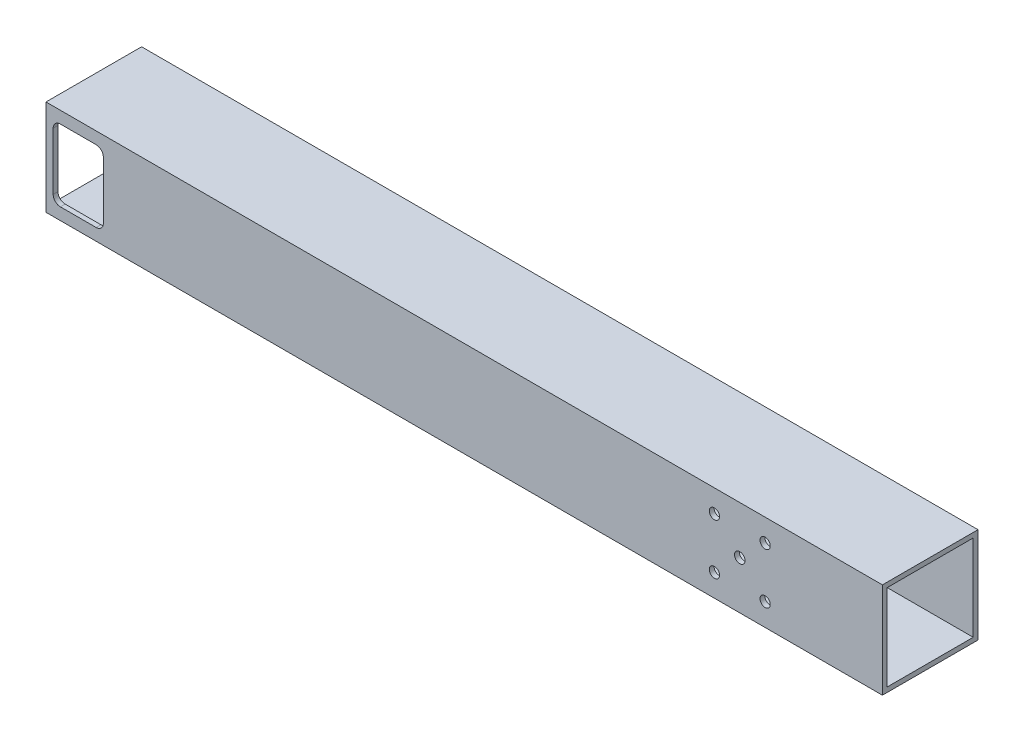
ISO-10303-21;
HEADER;
FILE_DESCRIPTION(('STEP AP214'),'2;1');
FILE_NAME('part.step','',(''),(''),'','','');
FILE_SCHEMA(('AUTOMOTIVE_DESIGN { 1 0 10303 214 1 1 1 1 }'));
ENDSEC;
DATA;
#1=APPLICATION_CONTEXT('core data for automotive mechanical design processes');
#2=APPLICATION_PROTOCOL_DEFINITION('international standard','automotive_design',2000,#1);
#3=PRODUCT_CONTEXT('',#1,'mechanical');
#4=PRODUCT('Part','Part','',(#3));
#5=PRODUCT_RELATED_PRODUCT_CATEGORY('part','',(#4));
#6=PRODUCT_DEFINITION_FORMATION('','',#4);
#7=PRODUCT_DEFINITION_CONTEXT('part definition',#1,'design');
#8=PRODUCT_DEFINITION('design','',#6,#7);
#9=PRODUCT_DEFINITION_SHAPE('','',#8);
#10=(LENGTH_UNIT() NAMED_UNIT(*) SI_UNIT(.MILLI.,.METRE.));
#11=(NAMED_UNIT(*) PLANE_ANGLE_UNIT() SI_UNIT($,.RADIAN.));
#12=(NAMED_UNIT(*) SI_UNIT($,.STERADIAN.) SOLID_ANGLE_UNIT());
#13=UNCERTAINTY_MEASURE_WITH_UNIT(LENGTH_MEASURE(1.E-05),#10,'distance_accuracy_value','');
#14=(GEOMETRIC_REPRESENTATION_CONTEXT(3) GLOBAL_UNCERTAINTY_ASSIGNED_CONTEXT((#13)) GLOBAL_UNIT_ASSIGNED_CONTEXT((#10,
#11,#12)) REPRESENTATION_CONTEXT('',''));
#15=CARTESIAN_POINT('',(0.,0.,0.));
#16=DIRECTION('',(0.,0.,1.));
#17=DIRECTION('',(1.,0.,0.));
#18=AXIS2_PLACEMENT_3D('',#15,#16,#17);
#19=CARTESIAN_POINT('',(350.,2.,-2.));
#20=DIRECTION('',(0.,0.,-1.));
#21=DIRECTION('',(-1.,0.,0.));
#22=AXIS2_PLACEMENT_3D('',#19,#20,#21);
#23=PLANE('',#22);
#24=CARTESIAN_POINT('',(21.,32.,-2.));
#25=DIRECTION('',(0.,0.,-1.));
#26=DIRECTION('',(-1.,0.,0.));
#27=AXIS2_PLACEMENT_3D('',#24,#25,#26);
#28=CIRCLE('',#27,3.);
#29=CARTESIAN_POINT('',(24.,32.,-2.));
#30=VERTEX_POINT('',#29);
#31=CARTESIAN_POINT('',(21.,35.,-2.));
#32=VERTEX_POINT('',#31);
#33=EDGE_CURVE('E377',#30,#32,#28,.F.);
#34=ORIENTED_EDGE('',*,*,#33,.T.);
#35=DIRECTION('',(-1.,0.,0.));
#36=VECTOR('',#35,1.);
#37=CARTESIAN_POINT('',(6.,35.,-2.));
#38=LINE('',#37,#36);
#39=CARTESIAN_POINT('',(5.99999999999995,35.,-2.));
#40=VERTEX_POINT('',#39);
#41=EDGE_CURVE('E507',#32,#40,#38,.T.);
#42=ORIENTED_EDGE('',*,*,#41,.T.);
#43=CARTESIAN_POINT('',(6.,32.,-2.));
#44=DIRECTION('',(0.,0.,-1.));
#45=DIRECTION('',(-1.,0.,0.));
#46=AXIS2_PLACEMENT_3D('',#43,#44,#45);
#47=CIRCLE('',#46,3.);
#48=CARTESIAN_POINT('',(3.,32.,-2.));
#49=VERTEX_POINT('',#48);
#50=EDGE_CURVE('E398',#40,#49,#47,.F.);
#51=ORIENTED_EDGE('',*,*,#50,.T.);
#52=DIRECTION('',(0.,-1.,0.));
#53=VECTOR('',#52,1.);
#54=CARTESIAN_POINT('',(3.,32.,-2.));
#55=LINE('',#54,#53);
#56=CARTESIAN_POINT('',(3.,8.,-2.));
#57=VERTEX_POINT('',#56);
#58=EDGE_CURVE('E399',#49,#57,#55,.T.);
#59=ORIENTED_EDGE('',*,*,#58,.T.);
#60=CARTESIAN_POINT('',(6.,8.,-2.));
#61=DIRECTION('',(0.,0.,-1.));
#62=DIRECTION('',(-1.,0.,0.));
#63=AXIS2_PLACEMENT_3D('',#60,#61,#62);
#64=CIRCLE('',#63,3.);
#65=CARTESIAN_POINT('',(6.,5.,-2.));
#66=VERTEX_POINT('',#65);
#67=EDGE_CURVE('E404',#57,#66,#64,.F.);
#68=ORIENTED_EDGE('',*,*,#67,.T.);
#69=DIRECTION('',(1.,0.,0.));
#70=VECTOR('',#69,1.);
#71=CARTESIAN_POINT('',(6.,5.,-2.));
#72=LINE('',#71,#70);
#73=CARTESIAN_POINT('',(21.,5.,-2.));
#74=VERTEX_POINT('',#73);
#75=EDGE_CURVE('E408',#66,#74,#72,.T.);
#76=ORIENTED_EDGE('',*,*,#75,.T.);
#77=CARTESIAN_POINT('',(21.,8.,-2.));
#78=DIRECTION('',(0.,0.,-1.));
#79=DIRECTION('',(-1.,0.,0.));
#80=AXIS2_PLACEMENT_3D('',#77,#78,#79);
#81=CIRCLE('',#80,3.);
#82=CARTESIAN_POINT('',(24.,8.,-2.));
#83=VERTEX_POINT('',#82);
#84=EDGE_CURVE('E381',#74,#83,#81,.F.);
#85=ORIENTED_EDGE('',*,*,#84,.T.);
#86=DIRECTION('',(0.,1.,0.));
#87=VECTOR('',#86,1.);
#88=CARTESIAN_POINT('',(24.,32.,-2.));
#89=LINE('',#88,#87);
#90=EDGE_CURVE('E382',#83,#30,#89,.T.);
#91=ORIENTED_EDGE('',*,*,#90,.T.);
#92=EDGE_LOOP('',(#34,#42,#51,#59,#68,#76,#85,#91));
#93=FACE_BOUND('',#92,.T.);
#94=CARTESIAN_POINT('',(290.312997683596,19.9999999999998,-2.));
#95=DIRECTION('',(0.,0.,-1.));
#96=DIRECTION('',(-1.,0.,0.));
#97=AXIS2_PLACEMENT_3D('',#94,#95,#96);
#98=CIRCLE('',#97,2.19999999999998);
#99=CARTESIAN_POINT('',(288.112997683597,19.9999999999998,-2.));
#100=VERTEX_POINT('',#99);
#101=EDGE_CURVE('E204',#100,#100,#98,.T.);
#102=ORIENTED_EDGE('',*,*,#101,.F.);
#103=EDGE_LOOP('',(#102));
#104=FACE_BOUND('',#103,.T.);
#105=CARTESIAN_POINT('',(300.919599401395,30.6066017177983,-2.));
#106=DIRECTION('',(0.,0.,-1.));
#107=DIRECTION('',(-1.,0.,0.));
#108=AXIS2_PLACEMENT_3D('',#105,#106,#107);
#109=CIRCLE('',#108,2.14999999999999);
#110=CARTESIAN_POINT('',(298.769599401395,30.6066017177983,-2.));
#111=VERTEX_POINT('',#110);
#112=EDGE_CURVE('E231',#111,#111,#109,.F.);
#113=ORIENTED_EDGE('',*,*,#112,.T.);
#114=EDGE_LOOP('',(#113));
#115=FACE_BOUND('',#114,.T.);
#116=CARTESIAN_POINT('',(300.919599401395,9.39339828220176,-2.));
#117=DIRECTION('',(0.,0.,-1.));
#118=DIRECTION('',(-1.,0.,0.));
#119=AXIS2_PLACEMENT_3D('',#116,#117,#118);
#120=CIRCLE('',#119,2.14999999999999);
#121=CARTESIAN_POINT('',(298.769599401395,9.39339828220176,-2.));
#122=VERTEX_POINT('',#121);
#123=EDGE_CURVE('E239',#122,#122,#120,.F.);
#124=ORIENTED_EDGE('',*,*,#123,.T.);
#125=EDGE_LOOP('',(#124));
#126=FACE_BOUND('',#125,.T.);
#127=CARTESIAN_POINT('',(279.706395965798,9.39339828220152,-2.));
#128=DIRECTION('',(0.,0.,-1.));
#129=DIRECTION('',(-1.,0.,0.));
#130=AXIS2_PLACEMENT_3D('',#127,#128,#129);
#131=CIRCLE('',#130,2.14999999999999);
#132=CARTESIAN_POINT('',(277.556395965798,9.39339828220152,-2.));
#133=VERTEX_POINT('',#132);
#134=EDGE_CURVE('E247',#133,#133,#131,.F.);
#135=ORIENTED_EDGE('',*,*,#134,.T.);
#136=EDGE_LOOP('',(#135));
#137=FACE_BOUND('',#136,.T.);
#138=DIRECTION('',(0.,-1.,0.));
#139=VECTOR('',#138,1.);
#140=CARTESIAN_POINT('',(0.,2.,-2.));
#141=LINE('',#140,#139);
#142=CARTESIAN_POINT('',(0.,38.,-2.));
#143=VERTEX_POINT('',#142);
#144=CARTESIAN_POINT('',(0.,2.,-2.));
#145=VERTEX_POINT('',#144);
#146=EDGE_CURVE('E264',#143,#145,#141,.T.);
#147=ORIENTED_EDGE('',*,*,#146,.F.);
#148=DIRECTION('',(-1.,0.,0.));
#149=VECTOR('',#148,1.);
#150=CARTESIAN_POINT('',(350.,38.,-2.));
#151=LINE('',#150,#149);
#152=CARTESIAN_POINT('',(350.,38.,-2.));
#153=VERTEX_POINT('',#152);
#154=EDGE_CURVE('E292',#153,#143,#151,.T.);
#155=ORIENTED_EDGE('',*,*,#154,.F.);
#156=DIRECTION('',(0.,-1.,0.));
#157=VECTOR('',#156,1.);
#158=CARTESIAN_POINT('',(350.,2.,-2.));
#159=LINE('',#158,#157);
#160=CARTESIAN_POINT('',(350.,2.,-2.));
#161=VERTEX_POINT('',#160);
#162=EDGE_CURVE('E271',#153,#161,#159,.T.);
#163=ORIENTED_EDGE('',*,*,#162,.T.);
#164=DIRECTION('',(-1.,0.,0.));
#165=VECTOR('',#164,1.);
#166=CARTESIAN_POINT('',(350.,2.,-2.));
#167=LINE('',#166,#165);
#168=EDGE_CURVE('E274',#161,#145,#167,.T.);
#169=ORIENTED_EDGE('',*,*,#168,.T.);
#170=EDGE_LOOP('',(#147,#155,#163,#169));
#171=FACE_BOUND('',#170,.T.);
#172=CARTESIAN_POINT('',(279.706395965798,30.606601717798,-2.));
#173=DIRECTION('',(0.,0.,-1.));
#174=DIRECTION('',(-1.,0.,0.));
#175=AXIS2_PLACEMENT_3D('',#172,#173,#174);
#176=CIRCLE('',#175,2.14999999999999);
#177=CARTESIAN_POINT('',(277.556395965798,30.606601717798,-2.));
#178=VERTEX_POINT('',#177);
#179=EDGE_CURVE('E255',#178,#178,#176,.F.);
#180=ORIENTED_EDGE('',*,*,#179,.T.);
#181=EDGE_LOOP('',(#180));
#182=FACE_BOUND('',#181,.T.);
#183=ADVANCED_FACE('F46',(#93,#104,#115,#126,#137,#171,#182),#23,.T.);
#184=CARTESIAN_POINT('',(350.,0.,0.));
#185=DIRECTION('',(0.,0.,-1.));
#186=DIRECTION('',(-1.,0.,0.));
#187=AXIS2_PLACEMENT_3D('',#184,#185,#186);
#188=PLANE('',#187);
#189=DIRECTION('',(-1.,0.,0.));
#190=VECTOR('',#189,1.);
#191=CARTESIAN_POINT('',(350.,35.,0.));
#192=LINE('',#191,#190);
#193=CARTESIAN_POINT('',(6.,35.,0.));
#194=VERTEX_POINT('',#193);
#195=CARTESIAN_POINT('',(21.,35.,0.));
#196=VERTEX_POINT('',#195);
#197=EDGE_CURVE('E344',#194,#196,#192,.F.);
#198=ORIENTED_EDGE('',*,*,#197,.T.);
#199=CARTESIAN_POINT('',(21.,32.,0.));
#200=DIRECTION('',(0.,0.,1.));
#201=DIRECTION('',(1.,0.,0.));
#202=AXIS2_PLACEMENT_3D('',#199,#200,#201);
#203=CIRCLE('',#202,3.);
#204=CARTESIAN_POINT('',(24.,32.,0.));
#205=VERTEX_POINT('',#204);
#206=EDGE_CURVE('E11',#196,#205,#203,.F.);
#207=ORIENTED_EDGE('',*,*,#206,.T.);
#208=DIRECTION('',(0.,1.,0.));
#209=VECTOR('',#208,1.);
#210=CARTESIAN_POINT('',(24.,0.,0.));
#211=LINE('',#210,#209);
#212=CARTESIAN_POINT('',(24.,8.,0.));
#213=VERTEX_POINT('',#212);
#214=EDGE_CURVE('E56',#205,#213,#211,.F.);
#215=ORIENTED_EDGE('',*,*,#214,.T.);
#216=CARTESIAN_POINT('',(21.,8.,0.));
#217=DIRECTION('',(0.,0.,1.));
#218=DIRECTION('',(1.,0.,0.));
#219=AXIS2_PLACEMENT_3D('',#216,#217,#218);
#220=CIRCLE('',#219,3.);
#221=CARTESIAN_POINT('',(21.,5.,0.));
#222=VERTEX_POINT('',#221);
#223=EDGE_CURVE('E92',#213,#222,#220,.F.);
#224=ORIENTED_EDGE('',*,*,#223,.T.);
#225=DIRECTION('',(-1.,0.,0.));
#226=VECTOR('',#225,1.);
#227=CARTESIAN_POINT('',(350.,5.,0.));
#228=LINE('',#227,#226);
#229=CARTESIAN_POINT('',(6.,5.,0.));
#230=VERTEX_POINT('',#229);
#231=EDGE_CURVE('E360',#222,#230,#228,.T.);
#232=ORIENTED_EDGE('',*,*,#231,.T.);
#233=CARTESIAN_POINT('',(6.,8.,0.));
#234=DIRECTION('',(0.,0.,1.));
#235=DIRECTION('',(1.,0.,0.));
#236=AXIS2_PLACEMENT_3D('',#233,#234,#235);
#237=CIRCLE('',#236,3.);
#238=CARTESIAN_POINT('',(3.,8.,0.));
#239=VERTEX_POINT('',#238);
#240=EDGE_CURVE('E356',#230,#239,#237,.F.);
#241=ORIENTED_EDGE('',*,*,#240,.T.);
#242=DIRECTION('',(0.,1.,0.));
#243=VECTOR('',#242,1.);
#244=CARTESIAN_POINT('',(3.,0.,0.));
#245=LINE('',#244,#243);
#246=CARTESIAN_POINT('',(3.,32.,0.));
#247=VERTEX_POINT('',#246);
#248=EDGE_CURVE('E352',#239,#247,#245,.T.);
#249=ORIENTED_EDGE('',*,*,#248,.T.);
#250=CARTESIAN_POINT('',(6.,32.,0.));
#251=DIRECTION('',(0.,0.,1.));
#252=DIRECTION('',(1.,0.,0.));
#253=AXIS2_PLACEMENT_3D('',#250,#251,#252);
#254=CIRCLE('',#253,3.);
#255=EDGE_CURVE('E348',#247,#194,#254,.F.);
#256=ORIENTED_EDGE('',*,*,#255,.T.);
#257=EDGE_LOOP('',(#198,#207,#215,#224,#232,#241,#249,#256));
#258=FACE_BOUND('',#257,.T.);
#259=CARTESIAN_POINT('',(290.312997683596,19.9999999999998,0.));
#260=DIRECTION('',(0.,0.,-1.));
#261=DIRECTION('',(-1.,0.,0.));
#262=AXIS2_PLACEMENT_3D('',#259,#260,#261);
#263=CIRCLE('',#262,2.19999999999998);
#264=CARTESIAN_POINT('',(288.112997683597,19.9999999999998,0.));
#265=VERTEX_POINT('',#264);
#266=EDGE_CURVE('E198',#265,#265,#263,.T.);
#267=ORIENTED_EDGE('',*,*,#266,.T.);
#268=EDGE_LOOP('',(#267));
#269=FACE_BOUND('',#268,.T.);
#270=CARTESIAN_POINT('',(300.919599401395,30.6066017177983,0.));
#271=DIRECTION('',(0.,0.,1.));
#272=DIRECTION('',(1.,0.,0.));
#273=AXIS2_PLACEMENT_3D('',#270,#271,#272);
#274=CIRCLE('',#273,2.14999999999999);
#275=CARTESIAN_POINT('',(303.069599401394,30.6066017177983,0.));
#276=VERTEX_POINT('',#275);
#277=EDGE_CURVE('E227',#276,#276,#274,.T.);
#278=ORIENTED_EDGE('',*,*,#277,.F.);
#279=EDGE_LOOP('',(#278));
#280=FACE_BOUND('',#279,.T.);
#281=CARTESIAN_POINT('',(300.919599401395,9.39339828220176,0.));
#282=DIRECTION('',(0.,0.,1.));
#283=DIRECTION('',(1.,0.,0.));
#284=AXIS2_PLACEMENT_3D('',#281,#282,#283);
#285=CIRCLE('',#284,2.14999999999999);
#286=CARTESIAN_POINT('',(303.069599401395,9.39339828220176,0.));
#287=VERTEX_POINT('',#286);
#288=EDGE_CURVE('E235',#287,#287,#285,.T.);
#289=ORIENTED_EDGE('',*,*,#288,.F.);
#290=EDGE_LOOP('',(#289));
#291=FACE_BOUND('',#290,.T.);
#292=CARTESIAN_POINT('',(279.706395965798,9.39339828220152,0.));
#293=DIRECTION('',(0.,0.,1.));
#294=DIRECTION('',(1.,0.,0.));
#295=AXIS2_PLACEMENT_3D('',#292,#293,#294);
#296=CIRCLE('',#295,2.14999999999999);
#297=CARTESIAN_POINT('',(281.856395965798,9.39339828220152,0.));
#298=VERTEX_POINT('',#297);
#299=EDGE_CURVE('E243',#298,#298,#296,.T.);
#300=ORIENTED_EDGE('',*,*,#299,.F.);
#301=EDGE_LOOP('',(#300));
#302=FACE_BOUND('',#301,.T.);
#303=DIRECTION('',(0.,-1.,0.));
#304=VECTOR('',#303,1.);
#305=CARTESIAN_POINT('',(0.,0.,0.));
#306=LINE('',#305,#304);
#307=CARTESIAN_POINT('',(0.,40.,0.));
#308=VERTEX_POINT('',#307);
#309=CARTESIAN_POINT('',(0.,0.,0.));
#310=VERTEX_POINT('',#309);
#311=EDGE_CURVE('E302',#308,#310,#306,.T.);
#312=ORIENTED_EDGE('',*,*,#311,.T.);
#313=DIRECTION('',(-1.,0.,0.));
#314=VECTOR('',#313,1.);
#315=CARTESIAN_POINT('',(350.,0.,0.));
#316=LINE('',#315,#314);
#317=CARTESIAN_POINT('',(350.,0.,0.));
#318=VERTEX_POINT('',#317);
#319=EDGE_CURVE('E340',#318,#310,#316,.T.);
#320=ORIENTED_EDGE('',*,*,#319,.F.);
#321=DIRECTION('',(0.,-1.,0.));
#322=VECTOR('',#321,1.);
#323=CARTESIAN_POINT('',(350.,0.,0.));
#324=LINE('',#323,#322);
#325=CARTESIAN_POINT('',(350.,40.,0.));
#326=VERTEX_POINT('',#325);
#327=EDGE_CURVE('E303',#326,#318,#324,.T.);
#328=ORIENTED_EDGE('',*,*,#327,.F.);
#329=DIRECTION('',(-1.,0.,0.));
#330=VECTOR('',#329,1.);
#331=CARTESIAN_POINT('',(350.,40.,0.));
#332=LINE('',#331,#330);
#333=EDGE_CURVE('E317',#326,#308,#332,.T.);
#334=ORIENTED_EDGE('',*,*,#333,.T.);
#335=EDGE_LOOP('',(#312,#320,#328,#334));
#336=FACE_BOUND('',#335,.T.);
#337=CARTESIAN_POINT('',(279.706395965798,30.606601717798,0.));
#338=DIRECTION('',(0.,0.,1.));
#339=DIRECTION('',(1.,0.,0.));
#340=AXIS2_PLACEMENT_3D('',#337,#338,#339);
#341=CIRCLE('',#340,2.14999999999999);
#342=CARTESIAN_POINT('',(281.856395965798,30.606601717798,0.));
#343=VERTEX_POINT('',#342);
#344=EDGE_CURVE('E251',#343,#343,#341,.T.);
#345=ORIENTED_EDGE('',*,*,#344,.F.);
#346=EDGE_LOOP('',(#345));
#347=FACE_BOUND('',#346,.T.);
#348=ADVANCED_FACE('F48',(#258,#269,#280,#291,#302,#336,#347),#188,.F.);
#349=CARTESIAN_POINT('',(350.,0.,0.));
#350=DIRECTION('',(-1.,0.,0.));
#351=DIRECTION('',(0.,0.,1.));
#352=AXIS2_PLACEMENT_3D('',#349,#350,#351);
#353=PLANE('',#352);
#354=ORIENTED_EDGE('',*,*,#327,.T.);
#355=DIRECTION('',(0.,0.,-1.));
#356=VECTOR('',#355,1.);
#357=CARTESIAN_POINT('',(350.,0.,0.));
#358=LINE('',#357,#356);
#359=CARTESIAN_POINT('',(350.,0.,-40.));
#360=VERTEX_POINT('',#359);
#361=EDGE_CURVE('E307',#318,#360,#358,.T.);
#362=ORIENTED_EDGE('',*,*,#361,.T.);
#363=DIRECTION('',(0.,1.,0.));
#364=VECTOR('',#363,1.);
#365=CARTESIAN_POINT('',(350.,0.,-40.));
#366=LINE('',#365,#364);
#367=CARTESIAN_POINT('',(350.,40.,-40.));
#368=VERTEX_POINT('',#367);
#369=EDGE_CURVE('E311',#360,#368,#366,.T.);
#370=ORIENTED_EDGE('',*,*,#369,.T.);
#371=DIRECTION('',(0.,0.,1.));
#372=VECTOR('',#371,1.);
#373=CARTESIAN_POINT('',(350.,40.,0.));
#374=LINE('',#373,#372);
#375=EDGE_CURVE('E314',#368,#326,#374,.T.);
#376=ORIENTED_EDGE('',*,*,#375,.T.);
#377=EDGE_LOOP('',(#354,#362,#370,#376));
#378=FACE_BOUND('',#377,.T.);
#379=DIRECTION('',(0.,0.,-1.));
#380=VECTOR('',#379,1.);
#381=CARTESIAN_POINT('',(350.,2.,-2.));
#382=LINE('',#381,#380);
#383=CARTESIAN_POINT('',(350.,2.,-38.));
#384=VERTEX_POINT('',#383);
#385=EDGE_CURVE('E260',#161,#384,#382,.T.);
#386=ORIENTED_EDGE('',*,*,#385,.F.);
#387=ORIENTED_EDGE('',*,*,#162,.F.);
#388=DIRECTION('',(0.,0.,1.));
#389=VECTOR('',#388,1.);
#390=CARTESIAN_POINT('',(350.,38.,-2.));
#391=LINE('',#390,#389);
#392=CARTESIAN_POINT('',(350.,38.,-38.));
#393=VERTEX_POINT('',#392);
#394=EDGE_CURVE('E267',#393,#153,#391,.T.);
#395=ORIENTED_EDGE('',*,*,#394,.F.);
#396=DIRECTION('',(0.,1.,0.));
#397=VECTOR('',#396,1.);
#398=CARTESIAN_POINT('',(350.,2.,-38.));
#399=LINE('',#398,#397);
#400=EDGE_CURVE('E263',#384,#393,#399,.T.);
#401=ORIENTED_EDGE('',*,*,#400,.F.);
#402=EDGE_LOOP('',(#386,#387,#395,#401));
#403=FACE_BOUND('',#402,.T.);
#404=ADVANCED_FACE('F536',(#378,#403),#353,.F.);
#405=CARTESIAN_POINT('',(0.,0.,0.));
#406=DIRECTION('',(-1.,0.,0.));
#407=DIRECTION('',(0.,0.,1.));
#408=AXIS2_PLACEMENT_3D('',#405,#406,#407);
#409=PLANE('',#408);
#410=ORIENTED_EDGE('',*,*,#311,.F.);
#411=DIRECTION('',(0.,0.,1.));
#412=VECTOR('',#411,1.);
#413=CARTESIAN_POINT('',(0.,40.,0.));
#414=LINE('',#413,#412);
#415=CARTESIAN_POINT('',(0.,40.,-40.));
#416=VERTEX_POINT('',#415);
#417=EDGE_CURVE('E308',#416,#308,#414,.T.);
#418=ORIENTED_EDGE('',*,*,#417,.F.);
#419=DIRECTION('',(0.,1.,0.));
#420=VECTOR('',#419,1.);
#421=CARTESIAN_POINT('',(0.,0.,-40.));
#422=LINE('',#421,#420);
#423=CARTESIAN_POINT('',(0.,0.,-40.));
#424=VERTEX_POINT('',#423);
#425=EDGE_CURVE('E324',#424,#416,#422,.T.);
#426=ORIENTED_EDGE('',*,*,#425,.F.);
#427=DIRECTION('',(0.,0.,-1.));
#428=VECTOR('',#427,1.);
#429=CARTESIAN_POINT('',(0.,0.,0.));
#430=LINE('',#429,#428);
#431=EDGE_CURVE('E321',#310,#424,#430,.T.);
#432=ORIENTED_EDGE('',*,*,#431,.F.);
#433=EDGE_LOOP('',(#410,#418,#426,#432));
#434=FACE_BOUND('',#433,.T.);
#435=ORIENTED_EDGE('',*,*,#146,.T.);
#436=DIRECTION('',(0.,0.,-1.));
#437=VECTOR('',#436,1.);
#438=CARTESIAN_POINT('',(0.,2.,-2.));
#439=LINE('',#438,#437);
#440=CARTESIAN_POINT('',(0.,2.,-38.));
#441=VERTEX_POINT('',#440);
#442=EDGE_CURVE('E259',#145,#441,#439,.T.);
#443=ORIENTED_EDGE('',*,*,#442,.T.);
#444=DIRECTION('',(0.,1.,0.));
#445=VECTOR('',#444,1.);
#446=CARTESIAN_POINT('',(0.,2.,-38.));
#447=LINE('',#446,#445);
#448=CARTESIAN_POINT('',(0.,38.,-38.));
#449=VERTEX_POINT('',#448);
#450=EDGE_CURVE('E278',#441,#449,#447,.T.);
#451=ORIENTED_EDGE('',*,*,#450,.T.);
#452=DIRECTION('',(0.,0.,1.));
#453=VECTOR('',#452,1.);
#454=CARTESIAN_POINT('',(0.,38.,-2.));
#455=LINE('',#454,#453);
#456=EDGE_CURVE('E282',#449,#143,#455,.T.);
#457=ORIENTED_EDGE('',*,*,#456,.T.);
#458=EDGE_LOOP('',(#435,#443,#451,#457));
#459=FACE_BOUND('',#458,.T.);
#460=ADVANCED_FACE('F556',(#434,#459),#409,.T.);
#461=CARTESIAN_POINT('',(350.,0.,0.));
#462=DIRECTION('',(0.,1.,0.));
#463=DIRECTION('',(0.,0.,1.));
#464=AXIS2_PLACEMENT_3D('',#461,#462,#463);
#465=PLANE('',#464);
#466=ORIENTED_EDGE('',*,*,#431,.T.);
#467=DIRECTION('',(-1.,0.,0.));
#468=VECTOR('',#467,1.);
#469=CARTESIAN_POINT('',(350.,0.,-40.));
#470=LINE('',#469,#468);
#471=EDGE_CURVE('E336',#360,#424,#470,.T.);
#472=ORIENTED_EDGE('',*,*,#471,.F.);
#473=ORIENTED_EDGE('',*,*,#361,.F.);
#474=ORIENTED_EDGE('',*,*,#319,.T.);
#475=EDGE_LOOP('',(#466,#472,#473,#474));
#476=FACE_BOUND('',#475,.T.);
#477=ADVANCED_FACE('F560',(#476),#465,.F.);
#478=CARTESIAN_POINT('',(350.,0.,-40.));
#479=DIRECTION('',(0.,0.,1.));
#480=DIRECTION('',(1.,0.,0.));
#481=AXIS2_PLACEMENT_3D('',#478,#479,#480);
#482=PLANE('',#481);
#483=CARTESIAN_POINT('',(20.2499999999992,30.9999999999986,-40.));
#484=DIRECTION('',(0.,0.,1.));
#485=DIRECTION('',(1.,0.,0.));
#486=AXIS2_PLACEMENT_3D('',#483,#484,#485);
#487=CIRCLE('',#486,1.69999999999999);
#488=CARTESIAN_POINT('',(21.9499999999992,30.9999999999986,-40.));
#489=VERTEX_POINT('',#488);
#490=EDGE_CURVE('E415',#489,#489,#487,.T.);
#491=ORIENTED_EDGE('',*,*,#490,.T.);
#492=EDGE_LOOP('',(#491));
#493=FACE_BOUND('',#492,.T.);
#494=CARTESIAN_POINT('',(13.4999999999993,30.9999999999986,-40.));
#495=DIRECTION('',(0.,0.,1.));
#496=DIRECTION('',(1.,0.,0.));
#497=AXIS2_PLACEMENT_3D('',#494,#495,#496);
#498=CIRCLE('',#497,1.7);
#499=CARTESIAN_POINT('',(15.1999999999993,30.9999999999986,-40.));
#500=VERTEX_POINT('',#499);
#501=EDGE_CURVE('E423',#500,#500,#498,.T.);
#502=ORIENTED_EDGE('',*,*,#501,.T.);
#503=EDGE_LOOP('',(#502));
#504=FACE_BOUND('',#503,.T.);
#505=CARTESIAN_POINT('',(6.74999999999926,30.9999999999986,-40.));
#506=DIRECTION('',(0.,0.,1.));
#507=DIRECTION('',(1.,0.,0.));
#508=AXIS2_PLACEMENT_3D('',#505,#506,#507);
#509=CIRCLE('',#508,1.7);
#510=CARTESIAN_POINT('',(8.44999999999925,30.9999999999986,-40.));
#511=VERTEX_POINT('',#510);
#512=EDGE_CURVE('E431',#511,#511,#509,.T.);
#513=ORIENTED_EDGE('',*,*,#512,.T.);
#514=EDGE_LOOP('',(#513));
#515=FACE_BOUND('',#514,.T.);
#516=CARTESIAN_POINT('',(20.2499999999992,8.99999999999856,-40.));
#517=DIRECTION('',(0.,0.,1.));
#518=DIRECTION('',(1.,0.,0.));
#519=AXIS2_PLACEMENT_3D('',#516,#517,#518);
#520=CIRCLE('',#519,1.69999999999999);
#521=CARTESIAN_POINT('',(21.9499999999992,8.99999999999856,-40.));
#522=VERTEX_POINT('',#521);
#523=EDGE_CURVE('E439',#522,#522,#520,.T.);
#524=ORIENTED_EDGE('',*,*,#523,.T.);
#525=EDGE_LOOP('',(#524));
#526=FACE_BOUND('',#525,.T.);
#527=CARTESIAN_POINT('',(13.4999999999993,8.99999999999856,-40.));
#528=DIRECTION('',(0.,0.,1.));
#529=DIRECTION('',(1.,0.,0.));
#530=AXIS2_PLACEMENT_3D('',#527,#528,#529);
#531=CIRCLE('',#530,1.7);
#532=CARTESIAN_POINT('',(15.1999999999993,8.99999999999856,-40.));
#533=VERTEX_POINT('',#532);
#534=EDGE_CURVE('E447',#533,#533,#531,.T.);
#535=ORIENTED_EDGE('',*,*,#534,.T.);
#536=EDGE_LOOP('',(#535));
#537=FACE_BOUND('',#536,.T.);
#538=CARTESIAN_POINT('',(6.74999999999923,8.99999999999856,-40.));
#539=DIRECTION('',(0.,0.,1.));
#540=DIRECTION('',(1.,0.,0.));
#541=AXIS2_PLACEMENT_3D('',#538,#539,#540);
#542=CIRCLE('',#541,1.7);
#543=CARTESIAN_POINT('',(8.44999999999922,8.99999999999856,-40.));
#544=VERTEX_POINT('',#543);
#545=EDGE_CURVE('E455',#544,#544,#542,.T.);
#546=ORIENTED_EDGE('',*,*,#545,.T.);
#547=EDGE_LOOP('',(#546));
#548=FACE_BOUND('',#547,.T.);
#549=DIRECTION('',(1.,0.,0.));
#550=VECTOR('',#549,1.);
#551=CARTESIAN_POINT('',(272.812997683596,37.5,-40.));
#552=LINE('',#551,#550);
#553=CARTESIAN_POINT('',(272.812997683596,37.5,-40.));
#554=VERTEX_POINT('',#553);
#555=CARTESIAN_POINT('',(307.812997683597,37.5,-40.));
#556=VERTEX_POINT('',#555);
#557=EDGE_CURVE('E185',#554,#556,#552,.T.);
#558=ORIENTED_EDGE('',*,*,#557,.F.);
#559=DIRECTION('',(0.,1.,0.));
#560=VECTOR('',#559,1.);
#561=CARTESIAN_POINT('',(272.812997683596,2.49999999999969,-40.));
#562=LINE('',#561,#560);
#563=CARTESIAN_POINT('',(272.812997683596,2.49999999999969,-40.));
#564=VERTEX_POINT('',#563);
#565=EDGE_CURVE('E196',#564,#554,#562,.T.);
#566=ORIENTED_EDGE('',*,*,#565,.F.);
#567=DIRECTION('',(-1.,0.,0.));
#568=VECTOR('',#567,1.);
#569=CARTESIAN_POINT('',(272.812997683596,2.49999999999969,-40.));
#570=LINE('',#569,#568);
#571=CARTESIAN_POINT('',(307.812997683597,2.49999999999969,-40.));
#572=VERTEX_POINT('',#571);
#573=EDGE_CURVE('E188',#572,#564,#570,.T.);
#574=ORIENTED_EDGE('',*,*,#573,.F.);
#575=DIRECTION('',(0.,-1.,0.));
#576=VECTOR('',#575,1.);
#577=CARTESIAN_POINT('',(307.812997683597,2.49999999999969,-40.));
#578=LINE('',#577,#576);
#579=EDGE_CURVE('E172',#556,#572,#578,.T.);
#580=ORIENTED_EDGE('',*,*,#579,.F.);
#581=EDGE_LOOP('',(#558,#566,#574,#580));
#582=FACE_BOUND('',#581,.T.);
#583=ORIENTED_EDGE('',*,*,#425,.T.);
#584=DIRECTION('',(-1.,0.,0.));
#585=VECTOR('',#584,1.);
#586=CARTESIAN_POINT('',(350.,40.,-40.));
#587=LINE('',#586,#585);
#588=EDGE_CURVE('E332',#368,#416,#587,.T.);
#589=ORIENTED_EDGE('',*,*,#588,.F.);
#590=ORIENTED_EDGE('',*,*,#369,.F.);
#591=ORIENTED_EDGE('',*,*,#471,.T.);
#592=EDGE_LOOP('',(#583,#589,#590,#591));
#593=FACE_BOUND('',#592,.T.);
#594=ADVANCED_FACE('F193',(#493,#504,#515,#526,#537,#548,#582,#593),#482,.F.);
#595=CARTESIAN_POINT('',(350.,40.,0.));
#596=DIRECTION('',(0.,-1.,0.));
#597=DIRECTION('',(0.,0.,-1.));
#598=AXIS2_PLACEMENT_3D('',#595,#596,#597);
#599=PLANE('',#598);
#600=ORIENTED_EDGE('',*,*,#417,.T.);
#601=ORIENTED_EDGE('',*,*,#333,.F.);
#602=ORIENTED_EDGE('',*,*,#375,.F.);
#603=ORIENTED_EDGE('',*,*,#588,.T.);
#604=EDGE_LOOP('',(#600,#601,#602,#603));
#605=FACE_BOUND('',#604,.T.);
#606=ADVANCED_FACE('F552',(#605),#599,.F.);
#607=CARTESIAN_POINT('',(350.,2.,-2.));
#608=DIRECTION('',(0.,1.,0.));
#609=DIRECTION('',(0.,0.,1.));
#610=AXIS2_PLACEMENT_3D('',#607,#608,#609);
#611=PLANE('',#610);
#612=ORIENTED_EDGE('',*,*,#442,.F.);
#613=ORIENTED_EDGE('',*,*,#168,.F.);
#614=ORIENTED_EDGE('',*,*,#385,.T.);
#615=DIRECTION('',(-1.,0.,0.));
#616=VECTOR('',#615,1.);
#617=CARTESIAN_POINT('',(350.,2.,-38.));
#618=LINE('',#617,#616);
#619=EDGE_CURVE('E298',#384,#441,#618,.T.);
#620=ORIENTED_EDGE('',*,*,#619,.T.);
#621=EDGE_LOOP('',(#612,#613,#614,#620));
#622=FACE_BOUND('',#621,.T.);
#623=ADVANCED_FACE('F548',(#622),#611,.T.);
#624=CARTESIAN_POINT('',(350.,2.,-38.));
#625=DIRECTION('',(0.,0.,1.));
#626=DIRECTION('',(1.,0.,0.));
#627=AXIS2_PLACEMENT_3D('',#624,#625,#626);
#628=PLANE('',#627);
#629=CARTESIAN_POINT('',(20.2499999999992,30.9999999999986,-38.));
#630=DIRECTION('',(0.,0.,1.));
#631=DIRECTION('',(1.,0.,0.));
#632=AXIS2_PLACEMENT_3D('',#629,#630,#631);
#633=CIRCLE('',#632,1.7);
#634=CARTESIAN_POINT('',(21.9499999999992,30.9999999999986,-38.));
#635=VERTEX_POINT('',#634);
#636=EDGE_CURVE('E411',#635,#635,#633,.T.);
#637=ORIENTED_EDGE('',*,*,#636,.F.);
#638=EDGE_LOOP('',(#637));
#639=FACE_BOUND('',#638,.T.);
#640=CARTESIAN_POINT('',(13.4999999999993,30.9999999999986,-38.));
#641=DIRECTION('',(0.,0.,1.));
#642=DIRECTION('',(1.,0.,0.));
#643=AXIS2_PLACEMENT_3D('',#640,#641,#642);
#644=CIRCLE('',#643,1.7);
#645=CARTESIAN_POINT('',(15.1999999999993,30.9999999999986,-38.));
#646=VERTEX_POINT('',#645);
#647=EDGE_CURVE('E419',#646,#646,#644,.T.);
#648=ORIENTED_EDGE('',*,*,#647,.F.);
#649=EDGE_LOOP('',(#648));
#650=FACE_BOUND('',#649,.T.);
#651=CARTESIAN_POINT('',(6.74999999999926,30.9999999999986,-38.));
#652=DIRECTION('',(0.,0.,1.));
#653=DIRECTION('',(1.,0.,0.));
#654=AXIS2_PLACEMENT_3D('',#651,#652,#653);
#655=CIRCLE('',#654,1.7);
#656=CARTESIAN_POINT('',(8.44999999999925,30.9999999999986,-38.));
#657=VERTEX_POINT('',#656);
#658=EDGE_CURVE('E427',#657,#657,#655,.T.);
#659=ORIENTED_EDGE('',*,*,#658,.F.);
#660=EDGE_LOOP('',(#659));
#661=FACE_BOUND('',#660,.T.);
#662=CARTESIAN_POINT('',(20.2499999999992,8.99999999999856,-38.));
#663=DIRECTION('',(0.,0.,1.));
#664=DIRECTION('',(1.,0.,0.));
#665=AXIS2_PLACEMENT_3D('',#662,#663,#664);
#666=CIRCLE('',#665,1.7);
#667=CARTESIAN_POINT('',(21.9499999999992,8.99999999999856,-38.));
#668=VERTEX_POINT('',#667);
#669=EDGE_CURVE('E435',#668,#668,#666,.T.);
#670=ORIENTED_EDGE('',*,*,#669,.F.);
#671=EDGE_LOOP('',(#670));
#672=FACE_BOUND('',#671,.T.);
#673=CARTESIAN_POINT('',(13.4999999999993,8.99999999999856,-38.));
#674=DIRECTION('',(0.,0.,1.));
#675=DIRECTION('',(1.,0.,0.));
#676=AXIS2_PLACEMENT_3D('',#673,#674,#675);
#677=CIRCLE('',#676,1.7);
#678=CARTESIAN_POINT('',(15.1999999999993,8.99999999999856,-38.));
#679=VERTEX_POINT('',#678);
#680=EDGE_CURVE('E443',#679,#679,#677,.T.);
#681=ORIENTED_EDGE('',*,*,#680,.F.);
#682=EDGE_LOOP('',(#681));
#683=FACE_BOUND('',#682,.T.);
#684=CARTESIAN_POINT('',(6.74999999999923,8.99999999999856,-38.));
#685=DIRECTION('',(0.,0.,1.));
#686=DIRECTION('',(1.,0.,0.));
#687=AXIS2_PLACEMENT_3D('',#684,#685,#686);
#688=CIRCLE('',#687,1.7);
#689=CARTESIAN_POINT('',(8.44999999999922,8.99999999999856,-38.));
#690=VERTEX_POINT('',#689);
#691=EDGE_CURVE('E451',#690,#690,#688,.T.);
#692=ORIENTED_EDGE('',*,*,#691,.F.);
#693=EDGE_LOOP('',(#692));
#694=FACE_BOUND('',#693,.T.);
#695=DIRECTION('',(0.,1.,0.));
#696=VECTOR('',#695,1.);
#697=CARTESIAN_POINT('',(272.812997683596,2.49999999999969,-38.));
#698=LINE('',#697,#696);
#699=CARTESIAN_POINT('',(272.812997683596,2.49999999999969,-38.));
#700=VERTEX_POINT('',#699);
#701=CARTESIAN_POINT('',(272.812997683596,37.5,-38.));
#702=VERTEX_POINT('',#701);
#703=EDGE_CURVE('E184',#700,#702,#698,.T.);
#704=ORIENTED_EDGE('',*,*,#703,.T.);
#705=DIRECTION('',(1.,0.,0.));
#706=VECTOR('',#705,1.);
#707=CARTESIAN_POINT('',(272.812997683596,37.5,-38.));
#708=LINE('',#707,#706);
#709=CARTESIAN_POINT('',(307.812997683597,37.5,-38.));
#710=VERTEX_POINT('',#709);
#711=EDGE_CURVE('E216',#702,#710,#708,.T.);
#712=ORIENTED_EDGE('',*,*,#711,.T.);
#713=DIRECTION('',(0.,-1.,0.));
#714=VECTOR('',#713,1.);
#715=CARTESIAN_POINT('',(307.812997683597,2.49999999999969,-38.));
#716=LINE('',#715,#714);
#717=CARTESIAN_POINT('',(307.812997683597,2.49999999999969,-38.));
#718=VERTEX_POINT('',#717);
#719=EDGE_CURVE('E191',#710,#718,#716,.T.);
#720=ORIENTED_EDGE('',*,*,#719,.T.);
#721=DIRECTION('',(-1.,0.,0.));
#722=VECTOR('',#721,1.);
#723=CARTESIAN_POINT('',(272.812997683596,2.49999999999969,-38.));
#724=LINE('',#723,#722);
#725=EDGE_CURVE('E107',#718,#700,#724,.T.);
#726=ORIENTED_EDGE('',*,*,#725,.T.);
#727=EDGE_LOOP('',(#704,#712,#720,#726));
#728=FACE_BOUND('',#727,.T.);
#729=ORIENTED_EDGE('',*,*,#450,.F.);
#730=ORIENTED_EDGE('',*,*,#619,.F.);
#731=ORIENTED_EDGE('',*,*,#400,.T.);
#732=DIRECTION('',(-1.,0.,0.));
#733=VECTOR('',#732,1.);
#734=CARTESIAN_POINT('',(350.,38.,-38.));
#735=LINE('',#734,#733);
#736=EDGE_CURVE('E295',#393,#449,#735,.T.);
#737=ORIENTED_EDGE('',*,*,#736,.T.);
#738=EDGE_LOOP('',(#729,#730,#731,#737));
#739=FACE_BOUND('',#738,.T.);
#740=ADVANCED_FACE('F544',(#639,#650,#661,#672,#683,#694,#728,#739),#628,.T.);
#741=CARTESIAN_POINT('',(350.,38.,-2.));
#742=DIRECTION('',(0.,-1.,0.));
#743=DIRECTION('',(0.,0.,-1.));
#744=AXIS2_PLACEMENT_3D('',#741,#742,#743);
#745=PLANE('',#744);
#746=ORIENTED_EDGE('',*,*,#456,.F.);
#747=ORIENTED_EDGE('',*,*,#736,.F.);
#748=ORIENTED_EDGE('',*,*,#394,.T.);
#749=ORIENTED_EDGE('',*,*,#154,.T.);
#750=EDGE_LOOP('',(#746,#747,#748,#749));
#751=FACE_BOUND('',#750,.T.);
#752=ADVANCED_FACE('F541',(#751),#745,.T.);
#753=CARTESIAN_POINT('',(279.706395965798,30.606601717798,0.));
#754=DIRECTION('',(0.,0.,1.));
#755=DIRECTION('',(1.,0.,0.));
#756=AXIS2_PLACEMENT_3D('',#753,#754,#755);
#757=CYLINDRICAL_SURFACE('',#756,2.14999999999999);
#758=ORIENTED_EDGE('',*,*,#179,.F.);
#759=EDGE_LOOP('',(#758));
#760=FACE_BOUND('',#759,.T.);
#761=ORIENTED_EDGE('',*,*,#344,.T.);
#762=EDGE_LOOP('',(#761));
#763=FACE_BOUND('',#762,.T.);
#764=ADVANCED_FACE('F539',(#760,#763),#757,.F.);
#765=CARTESIAN_POINT('',(279.706395965798,9.39339828220152,0.));
#766=DIRECTION('',(0.,0.,1.));
#767=DIRECTION('',(1.,0.,0.));
#768=AXIS2_PLACEMENT_3D('',#765,#766,#767);
#769=CYLINDRICAL_SURFACE('',#768,2.14999999999999);
#770=ORIENTED_EDGE('',*,*,#134,.F.);
#771=EDGE_LOOP('',(#770));
#772=FACE_BOUND('',#771,.T.);
#773=ORIENTED_EDGE('',*,*,#299,.T.);
#774=EDGE_LOOP('',(#773));
#775=FACE_BOUND('',#774,.T.);
#776=ADVANCED_FACE('F601',(#772,#775),#769,.F.);
#777=CARTESIAN_POINT('',(300.919599401395,9.39339828220176,0.));
#778=DIRECTION('',(0.,0.,1.));
#779=DIRECTION('',(1.,0.,0.));
#780=AXIS2_PLACEMENT_3D('',#777,#778,#779);
#781=CYLINDRICAL_SURFACE('',#780,2.14999999999999);
#782=ORIENTED_EDGE('',*,*,#123,.F.);
#783=EDGE_LOOP('',(#782));
#784=FACE_BOUND('',#783,.T.);
#785=ORIENTED_EDGE('',*,*,#288,.T.);
#786=EDGE_LOOP('',(#785));
#787=FACE_BOUND('',#786,.T.);
#788=ADVANCED_FACE('F606',(#784,#787),#781,.F.);
#789=CARTESIAN_POINT('',(300.919599401395,30.6066017177983,0.));
#790=DIRECTION('',(0.,0.,1.));
#791=DIRECTION('',(1.,0.,0.));
#792=AXIS2_PLACEMENT_3D('',#789,#790,#791);
#793=CYLINDRICAL_SURFACE('',#792,2.14999999999999);
#794=ORIENTED_EDGE('',*,*,#112,.F.);
#795=EDGE_LOOP('',(#794));
#796=FACE_BOUND('',#795,.T.);
#797=ORIENTED_EDGE('',*,*,#277,.T.);
#798=EDGE_LOOP('',(#797));
#799=FACE_BOUND('',#798,.T.);
#800=ADVANCED_FACE('F611',(#796,#799),#793,.F.);
#801=CARTESIAN_POINT('',(272.812997683596,2.49999999999969,11.4974746830588));
#802=DIRECTION('',(-1.,0.,0.));
#803=DIRECTION('',(0.,0.,1.));
#804=AXIS2_PLACEMENT_3D('',#801,#802,#803);
#805=PLANE('',#804);
#806=DIRECTION('',(0.,0.,-1.));
#807=VECTOR('',#806,1.);
#808=CARTESIAN_POINT('',(272.812997683596,2.49999999999969,11.4974746830588));
#809=LINE('',#808,#807);
#810=EDGE_CURVE('E166',#700,#564,#809,.T.);
#811=ORIENTED_EDGE('',*,*,#810,.T.);
#812=ORIENTED_EDGE('',*,*,#565,.T.);
#813=DIRECTION('',(0.,0.,-1.));
#814=VECTOR('',#813,1.);
#815=CARTESIAN_POINT('',(272.812997683596,37.5,11.4974746830588));
#816=LINE('',#815,#814);
#817=EDGE_CURVE('E211',#702,#554,#816,.T.);
#818=ORIENTED_EDGE('',*,*,#817,.F.);
#819=ORIENTED_EDGE('',*,*,#703,.F.);
#820=EDGE_LOOP('',(#811,#812,#818,#819));
#821=FACE_BOUND('',#820,.T.);
#822=ADVANCED_FACE('F619',(#821),#805,.F.);
#823=CARTESIAN_POINT('',(272.812997683596,37.5,11.4974746830588));
#824=DIRECTION('',(0.,1.,0.));
#825=DIRECTION('',(0.,0.,1.));
#826=AXIS2_PLACEMENT_3D('',#823,#824,#825);
#827=PLANE('',#826);
#828=ORIENTED_EDGE('',*,*,#817,.T.);
#829=ORIENTED_EDGE('',*,*,#557,.T.);
#830=DIRECTION('',(0.,0.,-1.));
#831=VECTOR('',#830,1.);
#832=CARTESIAN_POINT('',(307.812997683597,37.5,11.4974746830588));
#833=LINE('',#832,#831);
#834=EDGE_CURVE('E178',#710,#556,#833,.T.);
#835=ORIENTED_EDGE('',*,*,#834,.F.);
#836=ORIENTED_EDGE('',*,*,#711,.F.);
#837=EDGE_LOOP('',(#828,#829,#835,#836));
#838=FACE_BOUND('',#837,.T.);
#839=ADVANCED_FACE('F463',(#838),#827,.F.);
#840=CARTESIAN_POINT('',(307.812997683597,2.49999999999969,11.4974746830588));
#841=DIRECTION('',(1.,0.,0.));
#842=DIRECTION('',(0.,0.,-1.));
#843=AXIS2_PLACEMENT_3D('',#840,#841,#842);
#844=PLANE('',#843);
#845=ORIENTED_EDGE('',*,*,#834,.T.);
#846=ORIENTED_EDGE('',*,*,#579,.T.);
#847=DIRECTION('',(0.,0.,-1.));
#848=VECTOR('',#847,1.);
#849=CARTESIAN_POINT('',(307.812997683597,2.49999999999969,11.4974746830588));
#850=LINE('',#849,#848);
#851=EDGE_CURVE('E174',#718,#572,#850,.T.);
#852=ORIENTED_EDGE('',*,*,#851,.F.);
#853=ORIENTED_EDGE('',*,*,#719,.F.);
#854=EDGE_LOOP('',(#845,#846,#852,#853));
#855=FACE_BOUND('',#854,.T.);
#856=ADVANCED_FACE('F173',(#855),#844,.F.);
#857=CARTESIAN_POINT('',(272.812997683596,2.49999999999969,11.4974746830588));
#858=DIRECTION('',(0.,-1.,0.));
#859=DIRECTION('',(0.,0.,-1.));
#860=AXIS2_PLACEMENT_3D('',#857,#858,#859);
#861=PLANE('',#860);
#862=ORIENTED_EDGE('',*,*,#851,.T.);
#863=ORIENTED_EDGE('',*,*,#573,.T.);
#864=ORIENTED_EDGE('',*,*,#810,.F.);
#865=ORIENTED_EDGE('',*,*,#725,.F.);
#866=EDGE_LOOP('',(#862,#863,#864,#865));
#867=FACE_BOUND('',#866,.T.);
#868=ADVANCED_FACE('F187',(#867),#861,.F.);
#869=CARTESIAN_POINT('',(290.312997683596,19.9999999999998,-2.));
#870=DIRECTION('',(0.,0.,-1.));
#871=DIRECTION('',(-1.,0.,0.));
#872=AXIS2_PLACEMENT_3D('',#869,#870,#871);
#873=CYLINDRICAL_SURFACE('',#872,2.19999999999998);
#874=ORIENTED_EDGE('',*,*,#266,.F.);
#875=EDGE_LOOP('',(#874));
#876=FACE_BOUND('',#875,.T.);
#877=ORIENTED_EDGE('',*,*,#101,.T.);
#878=EDGE_LOOP('',(#877));
#879=FACE_BOUND('',#878,.T.);
#880=ADVANCED_FACE('F630',(#876,#879),#873,.F.);
#881=CARTESIAN_POINT('',(6.74999999999923,8.99999999999856,-38.));
#882=DIRECTION('',(0.,0.,1.));
#883=DIRECTION('',(1.,0.,0.));
#884=AXIS2_PLACEMENT_3D('',#881,#882,#883);
#885=CYLINDRICAL_SURFACE('',#884,1.7);
#886=ORIENTED_EDGE('',*,*,#691,.T.);
#887=EDGE_LOOP('',(#886));
#888=FACE_BOUND('',#887,.T.);
#889=ORIENTED_EDGE('',*,*,#545,.F.);
#890=EDGE_LOOP('',(#889));
#891=FACE_BOUND('',#890,.T.);
#892=ADVANCED_FACE('F633',(#888,#891),#885,.F.);
#893=CARTESIAN_POINT('',(13.4999999999993,8.99999999999856,-38.));
#894=DIRECTION('',(0.,0.,1.));
#895=DIRECTION('',(1.,0.,0.));
#896=AXIS2_PLACEMENT_3D('',#893,#894,#895);
#897=CYLINDRICAL_SURFACE('',#896,1.7);
#898=ORIENTED_EDGE('',*,*,#680,.T.);
#899=EDGE_LOOP('',(#898));
#900=FACE_BOUND('',#899,.T.);
#901=ORIENTED_EDGE('',*,*,#534,.F.);
#902=EDGE_LOOP('',(#901));
#903=FACE_BOUND('',#902,.T.);
#904=ADVANCED_FACE('F637',(#900,#903),#897,.F.);
#905=CARTESIAN_POINT('',(20.2499999999992,8.99999999999856,-38.));
#906=DIRECTION('',(0.,0.,1.));
#907=DIRECTION('',(1.,0.,0.));
#908=AXIS2_PLACEMENT_3D('',#905,#906,#907);
#909=CYLINDRICAL_SURFACE('',#908,1.69999999999999);
#910=ORIENTED_EDGE('',*,*,#669,.T.);
#911=EDGE_LOOP('',(#910));
#912=FACE_BOUND('',#911,.T.);
#913=ORIENTED_EDGE('',*,*,#523,.F.);
#914=EDGE_LOOP('',(#913));
#915=FACE_BOUND('',#914,.T.);
#916=ADVANCED_FACE('F641',(#912,#915),#909,.F.);
#917=CARTESIAN_POINT('',(6.74999999999926,30.9999999999986,-38.));
#918=DIRECTION('',(0.,0.,1.));
#919=DIRECTION('',(1.,0.,0.));
#920=AXIS2_PLACEMENT_3D('',#917,#918,#919);
#921=CYLINDRICAL_SURFACE('',#920,1.7);
#922=ORIENTED_EDGE('',*,*,#658,.T.);
#923=EDGE_LOOP('',(#922));
#924=FACE_BOUND('',#923,.T.);
#925=ORIENTED_EDGE('',*,*,#512,.F.);
#926=EDGE_LOOP('',(#925));
#927=FACE_BOUND('',#926,.T.);
#928=ADVANCED_FACE('F645',(#924,#927),#921,.F.);
#929=CARTESIAN_POINT('',(13.4999999999993,30.9999999999986,-38.));
#930=DIRECTION('',(0.,0.,1.));
#931=DIRECTION('',(1.,0.,0.));
#932=AXIS2_PLACEMENT_3D('',#929,#930,#931);
#933=CYLINDRICAL_SURFACE('',#932,1.7);
#934=ORIENTED_EDGE('',*,*,#647,.T.);
#935=EDGE_LOOP('',(#934));
#936=FACE_BOUND('',#935,.T.);
#937=ORIENTED_EDGE('',*,*,#501,.F.);
#938=EDGE_LOOP('',(#937));
#939=FACE_BOUND('',#938,.T.);
#940=ADVANCED_FACE('F649',(#936,#939),#933,.F.);
#941=CARTESIAN_POINT('',(20.2499999999992,30.9999999999986,-38.));
#942=DIRECTION('',(0.,0.,1.));
#943=DIRECTION('',(1.,0.,0.));
#944=AXIS2_PLACEMENT_3D('',#941,#942,#943);
#945=CYLINDRICAL_SURFACE('',#944,1.69999999999999);
#946=ORIENTED_EDGE('',*,*,#636,.T.);
#947=EDGE_LOOP('',(#946));
#948=FACE_BOUND('',#947,.T.);
#949=ORIENTED_EDGE('',*,*,#490,.F.);
#950=EDGE_LOOP('',(#949));
#951=FACE_BOUND('',#950,.T.);
#952=ADVANCED_FACE('F653',(#948,#951),#945,.F.);
#953=CARTESIAN_POINT('',(21.,32.,-40.001));
#954=DIRECTION('',(0.,0.,1.));
#955=DIRECTION('',(1.,0.,0.));
#956=AXIS2_PLACEMENT_3D('',#953,#954,#955);
#957=CYLINDRICAL_SURFACE('',#956,3.);
#958=DIRECTION('',(0.,0.,1.));
#959=VECTOR('',#958,1.);
#960=CARTESIAN_POINT('',(21.,35.,-40.001));
#961=LINE('',#960,#959);
#962=EDGE_CURVE('E373',#32,#196,#961,.T.);
#963=ORIENTED_EDGE('',*,*,#962,.F.);
#964=ORIENTED_EDGE('',*,*,#33,.F.);
#965=DIRECTION('',(0.,0.,1.));
#966=VECTOR('',#965,1.);
#967=CARTESIAN_POINT('',(24.,32.,-40.001));
#968=LINE('',#967,#966);
#969=EDGE_CURVE('E375',#30,#205,#968,.T.);
#970=ORIENTED_EDGE('',*,*,#969,.T.);
#971=ORIENTED_EDGE('',*,*,#206,.F.);
#972=EDGE_LOOP('',(#963,#964,#970,#971));
#973=FACE_BOUND('',#972,.T.);
#974=ADVANCED_FACE('F371',(#973),#957,.F.);
#975=CARTESIAN_POINT('',(24.,32.,-40.001));
#976=DIRECTION('',(1.,0.,0.));
#977=DIRECTION('',(0.,1.,0.));
#978=AXIS2_PLACEMENT_3D('',#975,#976,#977);
#979=PLANE('',#978);
#980=ORIENTED_EDGE('',*,*,#969,.F.);
#981=ORIENTED_EDGE('',*,*,#90,.F.);
#982=DIRECTION('',(0.,0.,1.));
#983=VECTOR('',#982,1.);
#984=CARTESIAN_POINT('',(24.,8.,-40.001));
#985=LINE('',#984,#983);
#986=EDGE_CURVE('E387',#83,#213,#985,.T.);
#987=ORIENTED_EDGE('',*,*,#986,.T.);
#988=ORIENTED_EDGE('',*,*,#214,.F.);
#989=EDGE_LOOP('',(#980,#981,#987,#988));
#990=FACE_BOUND('',#989,.T.);
#991=ADVANCED_FACE('F485',(#990),#979,.F.);
#992=CARTESIAN_POINT('',(21.,8.,-40.001));
#993=DIRECTION('',(0.,0.,1.));
#994=DIRECTION('',(1.,0.,0.));
#995=AXIS2_PLACEMENT_3D('',#992,#993,#994);
#996=CYLINDRICAL_SURFACE('',#995,3.);
#997=ORIENTED_EDGE('',*,*,#986,.F.);
#998=ORIENTED_EDGE('',*,*,#84,.F.);
#999=DIRECTION('',(0.,0.,1.));
#1000=VECTOR('',#999,1.);
#1001=CARTESIAN_POINT('',(21.,5.,-40.001));
#1002=LINE('',#1001,#1000);
#1003=EDGE_CURVE('E405',#74,#222,#1002,.T.);
#1004=ORIENTED_EDGE('',*,*,#1003,.T.);
#1005=ORIENTED_EDGE('',*,*,#223,.F.);
#1006=EDGE_LOOP('',(#997,#998,#1004,#1005));
#1007=FACE_BOUND('',#1006,.T.);
#1008=ADVANCED_FACE('F487',(#1007),#996,.F.);
#1009=CARTESIAN_POINT('',(6.,5.,-40.001));
#1010=DIRECTION('',(0.,-1.,0.));
#1011=DIRECTION('',(0.,0.,-1.));
#1012=AXIS2_PLACEMENT_3D('',#1009,#1010,#1011);
#1013=PLANE('',#1012);
#1014=ORIENTED_EDGE('',*,*,#1003,.F.);
#1015=ORIENTED_EDGE('',*,*,#75,.F.);
#1016=DIRECTION('',(0.,0.,1.));
#1017=VECTOR('',#1016,1.);
#1018=CARTESIAN_POINT('',(6.,5.,-40.001));
#1019=LINE('',#1018,#1017);
#1020=EDGE_CURVE('E400',#66,#230,#1019,.T.);
#1021=ORIENTED_EDGE('',*,*,#1020,.T.);
#1022=ORIENTED_EDGE('',*,*,#231,.F.);
#1023=EDGE_LOOP('',(#1014,#1015,#1021,#1022));
#1024=FACE_BOUND('',#1023,.T.);
#1025=ADVANCED_FACE('F522',(#1024),#1013,.F.);
#1026=CARTESIAN_POINT('',(6.,8.,-40.001));
#1027=DIRECTION('',(0.,0.,1.));
#1028=DIRECTION('',(1.,0.,0.));
#1029=AXIS2_PLACEMENT_3D('',#1026,#1027,#1028);
#1030=CYLINDRICAL_SURFACE('',#1029,3.);
#1031=ORIENTED_EDGE('',*,*,#1020,.F.);
#1032=ORIENTED_EDGE('',*,*,#67,.F.);
#1033=DIRECTION('',(0.,0.,1.));
#1034=VECTOR('',#1033,1.);
#1035=CARTESIAN_POINT('',(3.,8.,-40.001));
#1036=LINE('',#1035,#1034);
#1037=EDGE_CURVE('E394',#57,#239,#1036,.T.);
#1038=ORIENTED_EDGE('',*,*,#1037,.T.);
#1039=ORIENTED_EDGE('',*,*,#240,.F.);
#1040=EDGE_LOOP('',(#1031,#1032,#1038,#1039));
#1041=FACE_BOUND('',#1040,.T.);
#1042=ADVANCED_FACE('F521',(#1041),#1030,.F.);
#1043=CARTESIAN_POINT('',(3.,32.,-40.001));
#1044=DIRECTION('',(-1.,0.,0.));
#1045=DIRECTION('',(0.,-1.,0.));
#1046=AXIS2_PLACEMENT_3D('',#1043,#1044,#1045);
#1047=PLANE('',#1046);
#1048=ORIENTED_EDGE('',*,*,#1037,.F.);
#1049=ORIENTED_EDGE('',*,*,#58,.F.);
#1050=DIRECTION('',(0.,0.,1.));
#1051=VECTOR('',#1050,1.);
#1052=CARTESIAN_POINT('',(3.,32.,-40.001));
#1053=LINE('',#1052,#1051);
#1054=EDGE_CURVE('E392',#49,#247,#1053,.T.);
#1055=ORIENTED_EDGE('',*,*,#1054,.T.);
#1056=ORIENTED_EDGE('',*,*,#248,.F.);
#1057=EDGE_LOOP('',(#1048,#1049,#1055,#1056));
#1058=FACE_BOUND('',#1057,.T.);
#1059=ADVANCED_FACE('F519',(#1058),#1047,.F.);
#1060=CARTESIAN_POINT('',(6.,32.,-40.001));
#1061=DIRECTION('',(0.,0.,1.));
#1062=DIRECTION('',(1.,0.,0.));
#1063=AXIS2_PLACEMENT_3D('',#1060,#1061,#1062);
#1064=CYLINDRICAL_SURFACE('',#1063,3.);
#1065=ORIENTED_EDGE('',*,*,#1054,.F.);
#1066=ORIENTED_EDGE('',*,*,#50,.F.);
#1067=DIRECTION('',(0.,0.,1.));
#1068=VECTOR('',#1067,1.);
#1069=CARTESIAN_POINT('',(6.,35.,-40.001));
#1070=LINE('',#1069,#1068);
#1071=EDGE_CURVE('E64',#40,#194,#1070,.T.);
#1072=ORIENTED_EDGE('',*,*,#1071,.T.);
#1073=ORIENTED_EDGE('',*,*,#255,.F.);
#1074=EDGE_LOOP('',(#1065,#1066,#1072,#1073));
#1075=FACE_BOUND('',#1074,.T.);
#1076=ADVANCED_FACE('F691',(#1075),#1064,.F.);
#1077=CARTESIAN_POINT('',(6.,35.,-40.001));
#1078=DIRECTION('',(0.,1.,0.));
#1079=DIRECTION('',(0.,0.,1.));
#1080=AXIS2_PLACEMENT_3D('',#1077,#1078,#1079);
#1081=PLANE('',#1080);
#1082=ORIENTED_EDGE('',*,*,#1071,.F.);
#1083=ORIENTED_EDGE('',*,*,#41,.F.);
#1084=ORIENTED_EDGE('',*,*,#962,.T.);
#1085=ORIENTED_EDGE('',*,*,#197,.F.);
#1086=EDGE_LOOP('',(#1082,#1083,#1084,#1085));
#1087=FACE_BOUND('',#1086,.T.);
#1088=ADVANCED_FACE('F701',(#1087),#1081,.F.);
#1089=CLOSED_SHELL('',(#183,#348,#404,#460,#477,#594,#606,#623,#740,#752,#764,#776,#788,#800,
#822,#839,#856,#868,#880,#892,#904,#916,#928,#940,#952,#974,#991,#1008,#1025,#1042,#1059,#1076,#1088));
#1090=MANIFOLD_SOLID_BREP('B2',#1089);
#1091=ADVANCED_BREP_SHAPE_REPRESENTATION('',(#18,#1090),#14);
#1092=SHAPE_DEFINITION_REPRESENTATION(#9,#1091);
ENDSEC;
END-ISO-10303-21;
